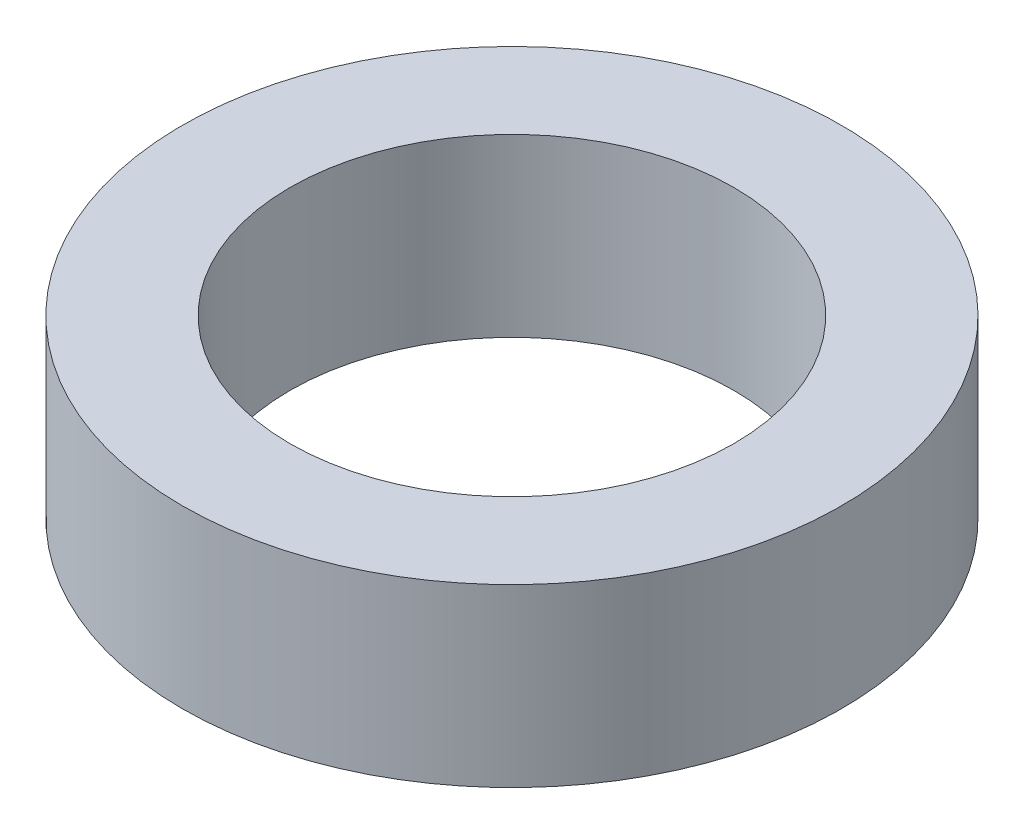
ISO-10303-21;
HEADER;
FILE_DESCRIPTION(('STEP AP214'),'2;1');
FILE_NAME('part.step','',(''),(''),'','','');
FILE_SCHEMA(('AUTOMOTIVE_DESIGN { 1 0 10303 214 1 1 1 1 }'));
ENDSEC;
DATA;
#1=APPLICATION_CONTEXT('core data for automotive mechanical design processes');
#2=APPLICATION_PROTOCOL_DEFINITION('international standard','automotive_design',2000,#1);
#3=PRODUCT_CONTEXT('',#1,'mechanical');
#4=PRODUCT('Part','Part','',(#3));
#5=PRODUCT_RELATED_PRODUCT_CATEGORY('part','',(#4));
#6=PRODUCT_DEFINITION_FORMATION('','',#4);
#7=PRODUCT_DEFINITION_CONTEXT('part definition',#1,'design');
#8=PRODUCT_DEFINITION('design','',#6,#7);
#9=PRODUCT_DEFINITION_SHAPE('','',#8);
#10=(LENGTH_UNIT() NAMED_UNIT(*) SI_UNIT(.MILLI.,.METRE.));
#11=(NAMED_UNIT(*) PLANE_ANGLE_UNIT() SI_UNIT($,.RADIAN.));
#12=(NAMED_UNIT(*) SI_UNIT($,.STERADIAN.) SOLID_ANGLE_UNIT());
#13=UNCERTAINTY_MEASURE_WITH_UNIT(LENGTH_MEASURE(1.E-05),#10,'distance_accuracy_value','');
#14=(GEOMETRIC_REPRESENTATION_CONTEXT(3) GLOBAL_UNCERTAINTY_ASSIGNED_CONTEXT((#13)) GLOBAL_UNIT_ASSIGNED_CONTEXT((#10,
#11,#12)) REPRESENTATION_CONTEXT('',''));
#15=CARTESIAN_POINT('',(0.,0.,0.));
#16=DIRECTION('',(0.,0.,1.));
#17=DIRECTION('',(1.,0.,0.));
#18=AXIS2_PLACEMENT_3D('',#15,#16,#17);
#19=CARTESIAN_POINT('',(0.,8.,0.));
#20=DIRECTION('',(0.,1.,0.));
#21=DIRECTION('',(0.,0.,1.));
#22=AXIS2_PLACEMENT_3D('',#19,#20,#21);
#23=PLANE('',#22);
#24=CARTESIAN_POINT('',(0.,8.,0.));
#25=DIRECTION('',(0.,1.,0.));
#26=DIRECTION('',(0.,0.,1.));
#27=AXIS2_PLACEMENT_3D('',#24,#25,#26);
#28=CIRCLE('',#27,15.);
#29=CARTESIAN_POINT('',(0.,8.,15.));
#30=VERTEX_POINT('',#29);
#31=EDGE_CURVE('E10',#30,#30,#28,.T.);
#32=ORIENTED_EDGE('',*,*,#31,.T.);
#33=EDGE_LOOP('',(#32));
#34=FACE_BOUND('',#33,.T.);
#35=CARTESIAN_POINT('',(0.,8.,0.));
#36=DIRECTION('',(0.,1.,0.));
#37=DIRECTION('',(0.,0.,1.));
#38=AXIS2_PLACEMENT_3D('',#35,#36,#37);
#39=CIRCLE('',#38,10.1);
#40=CARTESIAN_POINT('',(0.,8.,10.1));
#41=VERTEX_POINT('',#40);
#42=EDGE_CURVE('E48',#41,#41,#39,.T.);
#43=ORIENTED_EDGE('',*,*,#42,.F.);
#44=EDGE_LOOP('',(#43));
#45=FACE_BOUND('',#44,.T.);
#46=ADVANCED_FACE('F40',(#34,#45),#23,.T.);
#47=CARTESIAN_POINT('',(0.,0.,0.));
#48=DIRECTION('',(0.,1.,0.));
#49=DIRECTION('',(0.,0.,1.));
#50=AXIS2_PLACEMENT_3D('',#47,#48,#49);
#51=PLANE('',#50);
#52=CARTESIAN_POINT('',(0.,0.,0.));
#53=DIRECTION('',(0.,1.,0.));
#54=DIRECTION('',(0.,0.,1.));
#55=AXIS2_PLACEMENT_3D('',#52,#53,#54);
#56=CIRCLE('',#55,15.);
#57=CARTESIAN_POINT('',(0.,0.,15.));
#58=VERTEX_POINT('',#57);
#59=EDGE_CURVE('E41',#58,#58,#56,.T.);
#60=ORIENTED_EDGE('',*,*,#59,.F.);
#61=EDGE_LOOP('',(#60));
#62=FACE_BOUND('',#61,.T.);
#63=CARTESIAN_POINT('',(0.,0.,0.));
#64=DIRECTION('',(0.,1.,0.));
#65=DIRECTION('',(0.,0.,1.));
#66=AXIS2_PLACEMENT_3D('',#63,#64,#65);
#67=CIRCLE('',#66,10.1);
#68=CARTESIAN_POINT('',(0.,0.,10.1));
#69=VERTEX_POINT('',#68);
#70=EDGE_CURVE('E49',#69,#69,#67,.T.);
#71=ORIENTED_EDGE('',*,*,#70,.T.);
#72=EDGE_LOOP('',(#71));
#73=FACE_BOUND('',#72,.T.);
#74=ADVANCED_FACE('F58',(#62,#73),#51,.F.);
#75=CARTESIAN_POINT('',(0.,8.,0.));
#76=DIRECTION('',(0.,-1.,0.));
#77=DIRECTION('',(0.,0.,-1.));
#78=AXIS2_PLACEMENT_3D('',#75,#76,#77);
#79=CYLINDRICAL_SURFACE('',#78,15.);
#80=ORIENTED_EDGE('',*,*,#31,.F.);
#81=EDGE_LOOP('',(#80));
#82=FACE_BOUND('',#81,.T.);
#83=ORIENTED_EDGE('',*,*,#59,.T.);
#84=EDGE_LOOP('',(#83));
#85=FACE_BOUND('',#84,.T.);
#86=ADVANCED_FACE('F39',(#82,#85),#79,.T.);
#87=CARTESIAN_POINT('',(0.,8.,0.));
#88=DIRECTION('',(0.,-1.,0.));
#89=DIRECTION('',(0.,0.,-1.));
#90=AXIS2_PLACEMENT_3D('',#87,#88,#89);
#91=CYLINDRICAL_SURFACE('',#90,10.1);
#92=ORIENTED_EDGE('',*,*,#42,.T.);
#93=EDGE_LOOP('',(#92));
#94=FACE_BOUND('',#93,.T.);
#95=ORIENTED_EDGE('',*,*,#70,.F.);
#96=EDGE_LOOP('',(#95));
#97=FACE_BOUND('',#96,.T.);
#98=ADVANCED_FACE('F57',(#94,#97),#91,.F.);
#99=CLOSED_SHELL('',(#46,#74,#86,#98));
#100=MANIFOLD_SOLID_BREP('B2',#99);
#101=ADVANCED_BREP_SHAPE_REPRESENTATION('',(#18,#100),#14);
#102=SHAPE_DEFINITION_REPRESENTATION(#9,#101);
ENDSEC;
END-ISO-10303-21;
